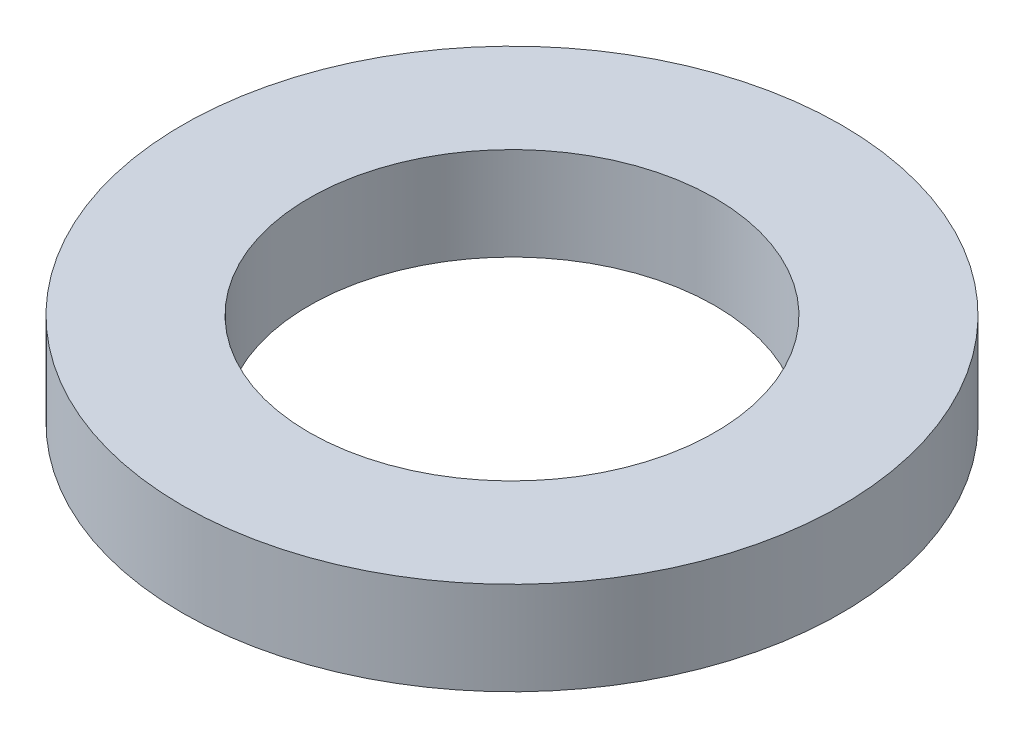
ISO-10303-21;
HEADER;
FILE_DESCRIPTION(('STEP AP214'),'2;1');
FILE_NAME('part.step','',(''),(''),'','','');
FILE_SCHEMA(('AUTOMOTIVE_DESIGN { 1 0 10303 214 1 1 1 1 }'));
ENDSEC;
DATA;
#1=APPLICATION_CONTEXT('core data for automotive mechanical design processes');
#2=APPLICATION_PROTOCOL_DEFINITION('international standard','automotive_design',2000,#1);
#3=PRODUCT_CONTEXT('',#1,'mechanical');
#4=PRODUCT('Part','Part','',(#3));
#5=PRODUCT_RELATED_PRODUCT_CATEGORY('part','',(#4));
#6=PRODUCT_DEFINITION_FORMATION('','',#4);
#7=PRODUCT_DEFINITION_CONTEXT('part definition',#1,'design');
#8=PRODUCT_DEFINITION('design','',#6,#7);
#9=PRODUCT_DEFINITION_SHAPE('','',#8);
#10=(LENGTH_UNIT() NAMED_UNIT(*) SI_UNIT(.MILLI.,.METRE.));
#11=(NAMED_UNIT(*) PLANE_ANGLE_UNIT() SI_UNIT($,.RADIAN.));
#12=(NAMED_UNIT(*) SI_UNIT($,.STERADIAN.) SOLID_ANGLE_UNIT());
#13=UNCERTAINTY_MEASURE_WITH_UNIT(LENGTH_MEASURE(1.E-05),#10,'distance_accuracy_value','');
#14=(GEOMETRIC_REPRESENTATION_CONTEXT(3) GLOBAL_UNCERTAINTY_ASSIGNED_CONTEXT((#13)) GLOBAL_UNIT_ASSIGNED_CONTEXT((#10,
#11,#12)) REPRESENTATION_CONTEXT('',''));
#15=CARTESIAN_POINT('',(0.,0.,0.));
#16=DIRECTION('',(0.,0.,1.));
#17=DIRECTION('',(1.,0.,0.));
#18=AXIS2_PLACEMENT_3D('',#15,#16,#17);
#19=CARTESIAN_POINT('',(0.,250.,0.));
#20=DIRECTION('',(0.,-1.,0.));
#21=DIRECTION('',(0.,0.,-1.));
#22=AXIS2_PLACEMENT_3D('',#19,#20,#21);
#23=CYLINDRICAL_SURFACE('',#22,885.);
#24=CARTESIAN_POINT('',(0.,250.,0.));
#25=DIRECTION('',(0.,1.,0.));
#26=DIRECTION('',(0.,0.,1.));
#27=AXIS2_PLACEMENT_3D('',#24,#25,#26);
#28=CIRCLE('',#27,885.);
#29=CARTESIAN_POINT('',(0.,250.,885.));
#30=VERTEX_POINT('',#29);
#31=EDGE_CURVE('E10',#30,#30,#28,.T.);
#32=ORIENTED_EDGE('',*,*,#31,.F.);
#33=EDGE_LOOP('',(#32));
#34=FACE_BOUND('',#33,.T.);
#35=CARTESIAN_POINT('',(0.,0.,0.));
#36=DIRECTION('',(0.,1.,0.));
#37=DIRECTION('',(0.,0.,1.));
#38=AXIS2_PLACEMENT_3D('',#35,#36,#37);
#39=CIRCLE('',#38,885.);
#40=CARTESIAN_POINT('',(0.,0.,885.));
#41=VERTEX_POINT('',#40);
#42=EDGE_CURVE('E33',#41,#41,#39,.T.);
#43=ORIENTED_EDGE('',*,*,#42,.T.);
#44=EDGE_LOOP('',(#43));
#45=FACE_BOUND('',#44,.T.);
#46=ADVANCED_FACE('F30',(#34,#45),#23,.T.);
#47=CARTESIAN_POINT('',(0.,250.,0.));
#48=DIRECTION('',(0.,1.,0.));
#49=DIRECTION('',(0.,0.,1.));
#50=AXIS2_PLACEMENT_3D('',#47,#48,#49);
#51=PLANE('',#50);
#52=CARTESIAN_POINT('',(0.,250.,0.));
#53=DIRECTION('',(0.,1.,0.));
#54=DIRECTION('',(0.,0.,1.));
#55=AXIS2_PLACEMENT_3D('',#52,#53,#54);
#56=CIRCLE('',#55,545.);
#57=CARTESIAN_POINT('',(0.,250.,545.));
#58=VERTEX_POINT('',#57);
#59=EDGE_CURVE('E42',#58,#58,#56,.T.);
#60=ORIENTED_EDGE('',*,*,#59,.F.);
#61=EDGE_LOOP('',(#60));
#62=FACE_BOUND('',#61,.T.);
#63=ORIENTED_EDGE('',*,*,#31,.T.);
#64=EDGE_LOOP('',(#63));
#65=FACE_BOUND('',#64,.T.);
#66=ADVANCED_FACE('F57',(#62,#65),#51,.T.);
#67=CARTESIAN_POINT('',(0.,0.,0.));
#68=DIRECTION('',(0.,1.,0.));
#69=DIRECTION('',(0.,0.,1.));
#70=AXIS2_PLACEMENT_3D('',#67,#68,#69);
#71=PLANE('',#70);
#72=CARTESIAN_POINT('',(0.,0.,0.));
#73=DIRECTION('',(0.,1.,0.));
#74=DIRECTION('',(0.,0.,1.));
#75=AXIS2_PLACEMENT_3D('',#72,#73,#74);
#76=CIRCLE('',#75,545.);
#77=CARTESIAN_POINT('',(0.,0.,545.));
#78=VERTEX_POINT('',#77);
#79=EDGE_CURVE('E40',#78,#78,#76,.T.);
#80=ORIENTED_EDGE('',*,*,#79,.T.);
#81=EDGE_LOOP('',(#80));
#82=FACE_BOUND('',#81,.T.);
#83=ORIENTED_EDGE('',*,*,#42,.F.);
#84=EDGE_LOOP('',(#83));
#85=FACE_BOUND('',#84,.T.);
#86=ADVANCED_FACE('F48',(#82,#85),#71,.F.);
#87=CARTESIAN_POINT('',(0.,0.,0.));
#88=DIRECTION('',(0.,1.,0.));
#89=DIRECTION('',(0.,0.,1.));
#90=AXIS2_PLACEMENT_3D('',#87,#88,#89);
#91=CYLINDRICAL_SURFACE('',#90,545.);
#92=ORIENTED_EDGE('',*,*,#79,.F.);
#93=EDGE_LOOP('',(#92));
#94=FACE_BOUND('',#93,.T.);
#95=ORIENTED_EDGE('',*,*,#59,.T.);
#96=EDGE_LOOP('',(#95));
#97=FACE_BOUND('',#96,.T.);
#98=ADVANCED_FACE('F51',(#94,#97),#91,.F.);
#99=CLOSED_SHELL('',(#46,#66,#86,#98));
#100=MANIFOLD_SOLID_BREP('B2',#99);
#101=ADVANCED_BREP_SHAPE_REPRESENTATION('',(#18,#100),#14);
#102=SHAPE_DEFINITION_REPRESENTATION(#9,#101);
ENDSEC;
END-ISO-10303-21;
